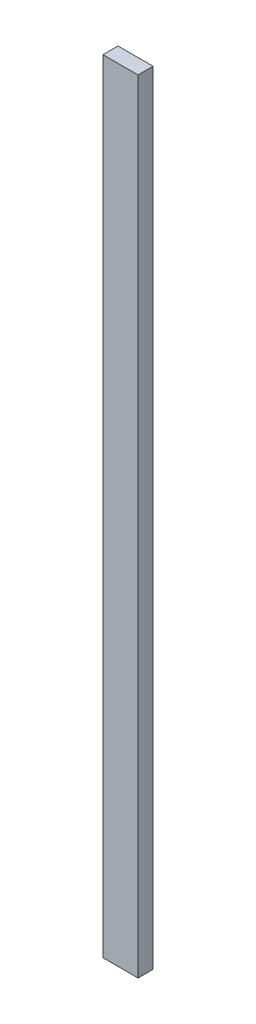
ISO-10303-21;
HEADER;
FILE_DESCRIPTION(('STEP AP214'),'2;1');
FILE_NAME('part.step','',(''),(''),'','','');
FILE_SCHEMA(('AUTOMOTIVE_DESIGN { 1 0 10303 214 1 1 1 1 }'));
ENDSEC;
DATA;
#1=APPLICATION_CONTEXT('core data for automotive mechanical design processes');
#2=APPLICATION_PROTOCOL_DEFINITION('international standard','automotive_design',2000,#1);
#3=PRODUCT_CONTEXT('',#1,'mechanical');
#4=PRODUCT('Part','Part','',(#3));
#5=PRODUCT_RELATED_PRODUCT_CATEGORY('part','',(#4));
#6=PRODUCT_DEFINITION_FORMATION('','',#4);
#7=PRODUCT_DEFINITION_CONTEXT('part definition',#1,'design');
#8=PRODUCT_DEFINITION('design','',#6,#7);
#9=PRODUCT_DEFINITION_SHAPE('','',#8);
#10=(LENGTH_UNIT() NAMED_UNIT(*) SI_UNIT(.MILLI.,.METRE.));
#11=(NAMED_UNIT(*) PLANE_ANGLE_UNIT() SI_UNIT($,.RADIAN.));
#12=(NAMED_UNIT(*) SI_UNIT($,.STERADIAN.) SOLID_ANGLE_UNIT());
#13=UNCERTAINTY_MEASURE_WITH_UNIT(LENGTH_MEASURE(1.E-05),#10,'distance_accuracy_value','');
#14=(GEOMETRIC_REPRESENTATION_CONTEXT(3) GLOBAL_UNCERTAINTY_ASSIGNED_CONTEXT((#13)) GLOBAL_UNIT_ASSIGNED_CONTEXT((#10,
#11,#12)) REPRESENTATION_CONTEXT('',''));
#15=CARTESIAN_POINT('',(0.,0.,0.));
#16=DIRECTION('',(0.,0.,1.));
#17=DIRECTION('',(1.,0.,0.));
#18=AXIS2_PLACEMENT_3D('',#15,#16,#17);
#19=CARTESIAN_POINT('',(0.,1981.2,0.));
#20=DIRECTION('',(1.,0.,0.));
#21=DIRECTION('',(0.,0.,-1.));
#22=AXIS2_PLACEMENT_3D('',#19,#20,#21);
#23=PLANE('',#22);
#24=DIRECTION('',(0.,0.,1.));
#25=VECTOR('',#24,1.);
#26=CARTESIAN_POINT('',(0.,0.,0.));
#27=LINE('',#26,#25);
#28=CARTESIAN_POINT('',(0.,0.,-38.1));
#29=VERTEX_POINT('',#28);
#30=CARTESIAN_POINT('',(0.,0.,0.));
#31=VERTEX_POINT('',#30);
#32=EDGE_CURVE('E96',#29,#31,#27,.T.);
#33=ORIENTED_EDGE('',*,*,#32,.T.);
#34=DIRECTION('',(0.,-1.,0.));
#35=VECTOR('',#34,1.);
#36=CARTESIAN_POINT('',(0.,1981.2,0.));
#37=LINE('',#36,#35);
#38=CARTESIAN_POINT('',(0.,1981.2,0.));
#39=VERTEX_POINT('',#38);
#40=EDGE_CURVE('E11',#39,#31,#37,.T.);
#41=ORIENTED_EDGE('',*,*,#40,.F.);
#42=DIRECTION('',(0.,0.,1.));
#43=VECTOR('',#42,1.);
#44=CARTESIAN_POINT('',(0.,1981.2,0.));
#45=LINE('',#44,#43);
#46=CARTESIAN_POINT('',(0.,1981.2,-38.1));
#47=VERTEX_POINT('',#46);
#48=EDGE_CURVE('E84',#47,#39,#45,.T.);
#49=ORIENTED_EDGE('',*,*,#48,.F.);
#50=DIRECTION('',(0.,-1.,0.));
#51=VECTOR('',#50,1.);
#52=CARTESIAN_POINT('',(0.,1981.2,-38.1));
#53=LINE('',#52,#51);
#54=EDGE_CURVE('E92',#47,#29,#53,.T.);
#55=ORIENTED_EDGE('',*,*,#54,.T.);
#56=EDGE_LOOP('',(#33,#41,#49,#55));
#57=FACE_BOUND('',#56,.T.);
#58=ADVANCED_FACE('F33',(#57),#23,.F.);
#59=CARTESIAN_POINT('',(0.,1981.2,0.));
#60=DIRECTION('',(0.,0.,-1.));
#61=DIRECTION('',(-1.,0.,0.));
#62=AXIS2_PLACEMENT_3D('',#59,#60,#61);
#63=PLANE('',#62);
#64=DIRECTION('',(1.,0.,0.));
#65=VECTOR('',#64,1.);
#66=CARTESIAN_POINT('',(0.,0.,0.));
#67=LINE('',#66,#65);
#68=CARTESIAN_POINT('',(88.9,0.,0.));
#69=VERTEX_POINT('',#68);
#70=EDGE_CURVE('E88',#31,#69,#67,.T.);
#71=ORIENTED_EDGE('',*,*,#70,.T.);
#72=DIRECTION('',(0.,-1.,0.));
#73=VECTOR('',#72,1.);
#74=CARTESIAN_POINT('',(88.9,1981.2,0.));
#75=LINE('',#74,#73);
#76=CARTESIAN_POINT('',(88.9,1981.2,0.));
#77=VERTEX_POINT('',#76);
#78=EDGE_CURVE('E41',#77,#69,#75,.T.);
#79=ORIENTED_EDGE('',*,*,#78,.F.);
#80=DIRECTION('',(1.,0.,0.));
#81=VECTOR('',#80,1.);
#82=CARTESIAN_POINT('',(0.,1981.2,0.));
#83=LINE('',#82,#81);
#84=EDGE_CURVE('E79',#39,#77,#83,.T.);
#85=ORIENTED_EDGE('',*,*,#84,.F.);
#86=ORIENTED_EDGE('',*,*,#40,.T.);
#87=EDGE_LOOP('',(#71,#79,#85,#86));
#88=FACE_BOUND('',#87,.T.);
#89=ADVANCED_FACE('F87',(#88),#63,.F.);
#90=CARTESIAN_POINT('',(88.9,1981.2,0.));
#91=DIRECTION('',(-1.,0.,0.));
#92=DIRECTION('',(0.,0.,1.));
#93=AXIS2_PLACEMENT_3D('',#90,#91,#92);
#94=PLANE('',#93);
#95=DIRECTION('',(0.,0.,-1.));
#96=VECTOR('',#95,1.);
#97=CARTESIAN_POINT('',(88.9,0.,0.));
#98=LINE('',#97,#96);
#99=CARTESIAN_POINT('',(88.9,0.,-38.1));
#100=VERTEX_POINT('',#99);
#101=EDGE_CURVE('E66',#69,#100,#98,.T.);
#102=ORIENTED_EDGE('',*,*,#101,.T.);
#103=DIRECTION('',(0.,-1.,0.));
#104=VECTOR('',#103,1.);
#105=CARTESIAN_POINT('',(88.9,1981.2,-38.1));
#106=LINE('',#105,#104);
#107=CARTESIAN_POINT('',(88.9,1981.2,-38.1));
#108=VERTEX_POINT('',#107);
#109=EDGE_CURVE('E89',#108,#100,#106,.T.);
#110=ORIENTED_EDGE('',*,*,#109,.F.);
#111=DIRECTION('',(0.,0.,-1.));
#112=VECTOR('',#111,1.);
#113=CARTESIAN_POINT('',(88.9,1981.2,0.));
#114=LINE('',#113,#112);
#115=EDGE_CURVE('E82',#77,#108,#114,.T.);
#116=ORIENTED_EDGE('',*,*,#115,.F.);
#117=ORIENTED_EDGE('',*,*,#78,.T.);
#118=EDGE_LOOP('',(#102,#110,#116,#117));
#119=FACE_BOUND('',#118,.T.);
#120=ADVANCED_FACE('F90',(#119),#94,.F.);
#121=CARTESIAN_POINT('',(0.,1981.2,-38.1));
#122=DIRECTION('',(0.,0.,1.));
#123=DIRECTION('',(1.,0.,0.));
#124=AXIS2_PLACEMENT_3D('',#121,#122,#123);
#125=PLANE('',#124);
#126=DIRECTION('',(-1.,0.,0.));
#127=VECTOR('',#126,1.);
#128=CARTESIAN_POINT('',(0.,0.,-38.1));
#129=LINE('',#128,#127);
#130=EDGE_CURVE('E72',#100,#29,#129,.T.);
#131=ORIENTED_EDGE('',*,*,#130,.T.);
#132=ORIENTED_EDGE('',*,*,#54,.F.);
#133=DIRECTION('',(-1.,0.,0.));
#134=VECTOR('',#133,1.);
#135=CARTESIAN_POINT('',(0.,1981.2,-38.1));
#136=LINE('',#135,#134);
#137=EDGE_CURVE('E49',#108,#47,#136,.T.);
#138=ORIENTED_EDGE('',*,*,#137,.F.);
#139=ORIENTED_EDGE('',*,*,#109,.T.);
#140=EDGE_LOOP('',(#131,#132,#138,#139));
#141=FACE_BOUND('',#140,.T.);
#142=ADVANCED_FACE('F103',(#141),#125,.F.);
#143=CARTESIAN_POINT('',(0.,1981.2,0.));
#144=DIRECTION('',(0.,-1.,0.));
#145=DIRECTION('',(0.,0.,-1.));
#146=AXIS2_PLACEMENT_3D('',#143,#144,#145);
#147=PLANE('',#146);
#148=ORIENTED_EDGE('',*,*,#48,.T.);
#149=ORIENTED_EDGE('',*,*,#84,.T.);
#150=ORIENTED_EDGE('',*,*,#115,.T.);
#151=ORIENTED_EDGE('',*,*,#137,.T.);
#152=EDGE_LOOP('',(#148,#149,#150,#151));
#153=FACE_BOUND('',#152,.T.);
#154=ADVANCED_FACE('F80',(#153),#147,.F.);
#155=CARTESIAN_POINT('',(0.,0.,0.));
#156=DIRECTION('',(0.,-1.,0.));
#157=DIRECTION('',(0.,0.,-1.));
#158=AXIS2_PLACEMENT_3D('',#155,#156,#157);
#159=PLANE('',#158);
#160=ORIENTED_EDGE('',*,*,#32,.F.);
#161=ORIENTED_EDGE('',*,*,#130,.F.);
#162=ORIENTED_EDGE('',*,*,#101,.F.);
#163=ORIENTED_EDGE('',*,*,#70,.F.);
#164=EDGE_LOOP('',(#160,#161,#162,#163));
#165=FACE_BOUND('',#164,.T.);
#166=ADVANCED_FACE('F106',(#165),#159,.T.);
#167=CLOSED_SHELL('',(#58,#89,#120,#142,#154,#166));
#168=MANIFOLD_SOLID_BREP('B2',#167);
#169=ADVANCED_BREP_SHAPE_REPRESENTATION('',(#18,#168),#14);
#170=SHAPE_DEFINITION_REPRESENTATION(#9,#169);
ENDSEC;
END-ISO-10303-21;
